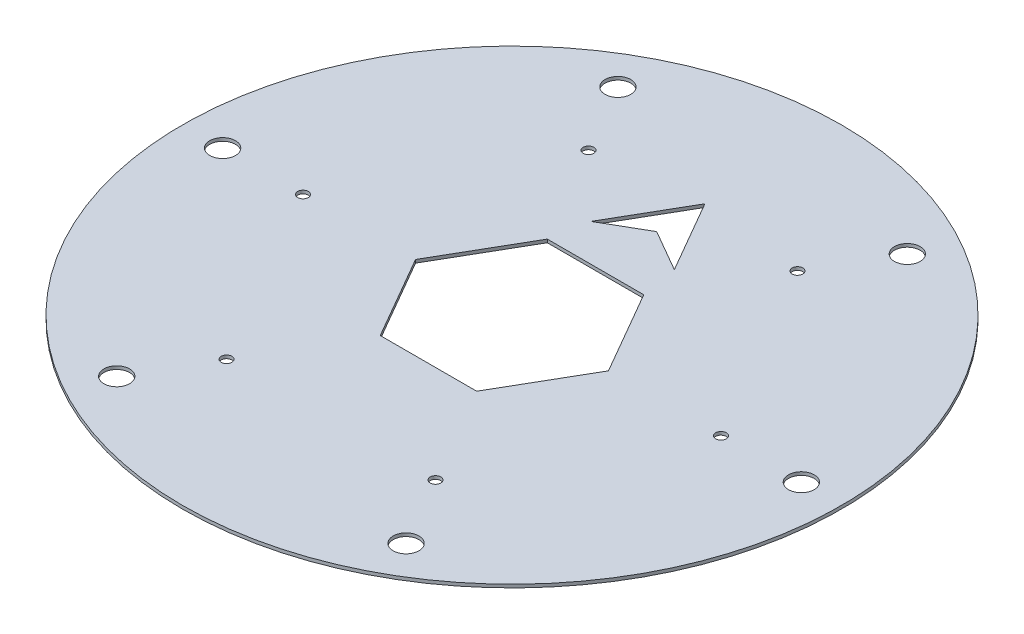
ISO-10303-21;
HEADER;
FILE_DESCRIPTION(('STEP AP214'),'2;1');
FILE_NAME('part.step','',(''),(''),'','','');
FILE_SCHEMA(('AUTOMOTIVE_DESIGN { 1 0 10303 214 1 1 1 1 }'));
ENDSEC;
DATA;
#1=APPLICATION_CONTEXT('core data for automotive mechanical design processes');
#2=APPLICATION_PROTOCOL_DEFINITION('international standard','automotive_design',2000,#1);
#3=PRODUCT_CONTEXT('',#1,'mechanical');
#4=PRODUCT('Part','Part','',(#3));
#5=PRODUCT_RELATED_PRODUCT_CATEGORY('part','',(#4));
#6=PRODUCT_DEFINITION_FORMATION('','',#4);
#7=PRODUCT_DEFINITION_CONTEXT('part definition',#1,'design');
#8=PRODUCT_DEFINITION('design','',#6,#7);
#9=PRODUCT_DEFINITION_SHAPE('','',#8);
#10=(LENGTH_UNIT() NAMED_UNIT(*) SI_UNIT(.MILLI.,.METRE.));
#11=(NAMED_UNIT(*) PLANE_ANGLE_UNIT() SI_UNIT($,.RADIAN.));
#12=(NAMED_UNIT(*) SI_UNIT($,.STERADIAN.) SOLID_ANGLE_UNIT());
#13=UNCERTAINTY_MEASURE_WITH_UNIT(LENGTH_MEASURE(1.E-05),#10,'distance_accuracy_value','');
#14=(GEOMETRIC_REPRESENTATION_CONTEXT(3) GLOBAL_UNCERTAINTY_ASSIGNED_CONTEXT((#13)) GLOBAL_UNIT_ASSIGNED_CONTEXT((#10,
#11,#12)) REPRESENTATION_CONTEXT('',''));
#15=CARTESIAN_POINT('',(0.,0.,0.));
#16=DIRECTION('',(0.,0.,1.));
#17=DIRECTION('',(1.,0.,0.));
#18=AXIS2_PLACEMENT_3D('',#15,#16,#17);
#19=CARTESIAN_POINT('',(0.,-1.,0.));
#20=DIRECTION('',(0.,1.,0.));
#21=DIRECTION('',(0.,0.,1.));
#22=AXIS2_PLACEMENT_3D('',#19,#20,#21);
#23=CYLINDRICAL_SURFACE('',#22,102.5);
#24=CARTESIAN_POINT('',(0.,-1.,0.));
#25=DIRECTION('',(0.,1.,0.));
#26=DIRECTION('',(0.,0.,1.));
#27=AXIS2_PLACEMENT_3D('',#24,#25,#26);
#28=CIRCLE('',#27,102.5);
#29=CARTESIAN_POINT('',(0.,-1.,102.5));
#30=VERTEX_POINT('',#29);
#31=EDGE_CURVE('E11',#30,#30,#28,.T.);
#32=ORIENTED_EDGE('',*,*,#31,.T.);
#33=EDGE_LOOP('',(#32));
#34=FACE_BOUND('',#33,.T.);
#35=CARTESIAN_POINT('',(0.,0.,0.));
#36=DIRECTION('',(0.,1.,0.));
#37=DIRECTION('',(0.,0.,1.));
#38=AXIS2_PLACEMENT_3D('',#35,#36,#37);
#39=CIRCLE('',#38,102.5);
#40=CARTESIAN_POINT('',(0.,0.,102.5));
#41=VERTEX_POINT('',#40);
#42=EDGE_CURVE('E40',#41,#41,#39,.T.);
#43=ORIENTED_EDGE('',*,*,#42,.F.);
#44=EDGE_LOOP('',(#43));
#45=FACE_BOUND('',#44,.T.);
#46=ADVANCED_FACE('F37',(#34,#45),#23,.T.);
#47=CARTESIAN_POINT('',(0.,-1.,0.));
#48=DIRECTION('',(0.,1.,0.));
#49=DIRECTION('',(0.,0.,1.));
#50=AXIS2_PLACEMENT_3D('',#47,#48,#49);
#51=PLANE('',#50);
#52=CARTESIAN_POINT('',(65.,-1.,0.));
#53=DIRECTION('',(0.,1.,0.));
#54=DIRECTION('',(0.,0.,1.));
#55=AXIS2_PLACEMENT_3D('',#52,#53,#54);
#56=CIRCLE('',#55,1.64999999999998);
#57=CARTESIAN_POINT('',(65.,-1.,1.64999999999998));
#58=VERTEX_POINT('',#57);
#59=EDGE_CURVE('E322',#58,#58,#56,.T.);
#60=ORIENTED_EDGE('',*,*,#59,.T.);
#61=EDGE_LOOP('',(#60));
#62=FACE_BOUND('',#61,.T.);
#63=CARTESIAN_POINT('',(32.5,-1.,-56.2916512459885));
#64=DIRECTION('',(0.,1.,0.));
#65=DIRECTION('',(0.,0.,1.));
#66=AXIS2_PLACEMENT_3D('',#63,#64,#65);
#67=CIRCLE('',#66,1.64999999999998);
#68=CARTESIAN_POINT('',(32.5,-1.,-54.6416512459885));
#69=VERTEX_POINT('',#68);
#70=EDGE_CURVE('E331',#69,#69,#67,.T.);
#71=ORIENTED_EDGE('',*,*,#70,.T.);
#72=EDGE_LOOP('',(#71));
#73=FACE_BOUND('',#72,.T.);
#74=CARTESIAN_POINT('',(-32.5,-1.,-56.2916512459885));
#75=DIRECTION('',(0.,1.,0.));
#76=DIRECTION('',(0.,0.,1.));
#77=AXIS2_PLACEMENT_3D('',#74,#75,#76);
#78=CIRCLE('',#77,1.64999999999999);
#79=CARTESIAN_POINT('',(-32.5,-1.,-54.6416512459885));
#80=VERTEX_POINT('',#79);
#81=EDGE_CURVE('E337',#80,#80,#78,.T.);
#82=ORIENTED_EDGE('',*,*,#81,.T.);
#83=EDGE_LOOP('',(#82));
#84=FACE_BOUND('',#83,.T.);
#85=CARTESIAN_POINT('',(-65.,-1.,0.));
#86=DIRECTION('',(0.,1.,0.));
#87=DIRECTION('',(0.,0.,1.));
#88=AXIS2_PLACEMENT_3D('',#85,#86,#87);
#89=CIRCLE('',#88,1.64999999999998);
#90=CARTESIAN_POINT('',(-65.,-1.,1.64999999999998));
#91=VERTEX_POINT('',#90);
#92=EDGE_CURVE('E343',#91,#91,#89,.T.);
#93=ORIENTED_EDGE('',*,*,#92,.T.);
#94=EDGE_LOOP('',(#93));
#95=FACE_BOUND('',#94,.T.);
#96=CARTESIAN_POINT('',(-32.5,-1.,56.2916512459885));
#97=DIRECTION('',(0.,1.,0.));
#98=DIRECTION('',(0.,0.,1.));
#99=AXIS2_PLACEMENT_3D('',#96,#97,#98);
#100=CIRCLE('',#99,1.64999999999999);
#101=CARTESIAN_POINT('',(-32.5,-1.,57.9416512459885));
#102=VERTEX_POINT('',#101);
#103=EDGE_CURVE('E349',#102,#102,#100,.T.);
#104=ORIENTED_EDGE('',*,*,#103,.T.);
#105=EDGE_LOOP('',(#104));
#106=FACE_BOUND('',#105,.T.);
#107=CARTESIAN_POINT('',(32.5,-1.,56.2916512459885));
#108=DIRECTION('',(0.,1.,0.));
#109=DIRECTION('',(0.,0.,1.));
#110=AXIS2_PLACEMENT_3D('',#107,#108,#109);
#111=CIRCLE('',#110,1.64999999999999);
#112=CARTESIAN_POINT('',(32.5,-1.,57.9416512459885));
#113=VERTEX_POINT('',#112);
#114=EDGE_CURVE('E355',#113,#113,#111,.T.);
#115=ORIENTED_EDGE('',*,*,#114,.T.);
#116=EDGE_LOOP('',(#115));
#117=FACE_BOUND('',#116,.T.);
#118=CARTESIAN_POINT('',(-45.0000000000009,-1.,-77.942286340599));
#119=DIRECTION('',(0.,1.,0.));
#120=DIRECTION('',(0.,0.,1.));
#121=AXIS2_PLACEMENT_3D('',#118,#119,#120);
#122=CIRCLE('',#121,4.);
#123=CARTESIAN_POINT('',(-45.0000000000009,-1.,-73.942286340599));
#124=VERTEX_POINT('',#123);
#125=EDGE_CURVE('E361',#124,#124,#122,.T.);
#126=ORIENTED_EDGE('',*,*,#125,.T.);
#127=EDGE_LOOP('',(#126));
#128=FACE_BOUND('',#127,.T.);
#129=CARTESIAN_POINT('',(44.9999999999993,-1.,-77.9422863405999));
#130=DIRECTION('',(0.,1.,0.));
#131=DIRECTION('',(0.,0.,1.));
#132=AXIS2_PLACEMENT_3D('',#129,#130,#131);
#133=CIRCLE('',#132,4.);
#134=CARTESIAN_POINT('',(44.9999999999993,-1.,-73.9422863405999));
#135=VERTEX_POINT('',#134);
#136=EDGE_CURVE('E367',#135,#135,#133,.T.);
#137=ORIENTED_EDGE('',*,*,#136,.T.);
#138=EDGE_LOOP('',(#137));
#139=FACE_BOUND('',#138,.T.);
#140=CARTESIAN_POINT('',(90.,-1.,0.));
#141=DIRECTION('',(0.,1.,0.));
#142=DIRECTION('',(0.,0.,1.));
#143=AXIS2_PLACEMENT_3D('',#140,#141,#142);
#144=CIRCLE('',#143,4.);
#145=CARTESIAN_POINT('',(90.,-1.,4.));
#146=VERTEX_POINT('',#145);
#147=EDGE_CURVE('E373',#146,#146,#144,.T.);
#148=ORIENTED_EDGE('',*,*,#147,.T.);
#149=EDGE_LOOP('',(#148));
#150=FACE_BOUND('',#149,.T.);
#151=CARTESIAN_POINT('',(45.0000000000004,-1.,77.9422863405993));
#152=DIRECTION('',(0.,1.,0.));
#153=DIRECTION('',(0.,0.,1.));
#154=AXIS2_PLACEMENT_3D('',#151,#152,#153);
#155=CIRCLE('',#154,4.);
#156=CARTESIAN_POINT('',(45.0000000000004,-1.,81.9422863405993));
#157=VERTEX_POINT('',#156);
#158=EDGE_CURVE('E379',#157,#157,#155,.T.);
#159=ORIENTED_EDGE('',*,*,#158,.T.);
#160=EDGE_LOOP('',(#159));
#161=FACE_BOUND('',#160,.T.);
#162=CARTESIAN_POINT('',(-44.9999999999998,-1.,77.9422863405996));
#163=DIRECTION('',(0.,1.,0.));
#164=DIRECTION('',(0.,0.,1.));
#165=AXIS2_PLACEMENT_3D('',#162,#163,#164);
#166=CIRCLE('',#165,4.);
#167=CARTESIAN_POINT('',(-44.9999999999998,-1.,81.9422863405996));
#168=VERTEX_POINT('',#167);
#169=EDGE_CURVE('E385',#168,#168,#166,.T.);
#170=ORIENTED_EDGE('',*,*,#169,.T.);
#171=EDGE_LOOP('',(#170));
#172=FACE_BOUND('',#171,.T.);
#173=CARTESIAN_POINT('',(-90.,-1.,0.));
#174=DIRECTION('',(0.,1.,0.));
#175=DIRECTION('',(0.,0.,1.));
#176=AXIS2_PLACEMENT_3D('',#173,#174,#175);
#177=CIRCLE('',#176,4.);
#178=CARTESIAN_POINT('',(-90.,-1.,4.));
#179=VERTEX_POINT('',#178);
#180=EDGE_CURVE('E138',#179,#179,#177,.T.);
#181=ORIENTED_EDGE('',*,*,#180,.T.);
#182=EDGE_LOOP('',(#181));
#183=FACE_BOUND('',#182,.T.);
#184=DIRECTION('',(1.,0.,0.));
#185=VECTOR('',#184,1.);
#186=CARTESIAN_POINT('',(-15.,-1.,25.9807621135332));
#187=LINE('',#186,#185);
#188=CARTESIAN_POINT('',(-15.,-1.,25.9807621135332));
#189=VERTEX_POINT('',#188);
#190=CARTESIAN_POINT('',(15.,-1.,25.9807621135332));
#191=VERTEX_POINT('',#190);
#192=EDGE_CURVE('E121',#189,#191,#187,.T.);
#193=ORIENTED_EDGE('',*,*,#192,.T.);
#194=DIRECTION('',(0.5,0.,-0.866025403784439));
#195=VECTOR('',#194,1.);
#196=CARTESIAN_POINT('',(15.,-1.,25.9807621135332));
#197=LINE('',#196,#195);
#198=CARTESIAN_POINT('',(30.,-1.,0.));
#199=VERTEX_POINT('',#198);
#200=EDGE_CURVE('E115',#191,#199,#197,.T.);
#201=ORIENTED_EDGE('',*,*,#200,.T.);
#202=DIRECTION('',(-0.5,0.,-0.866025403784439));
#203=VECTOR('',#202,1.);
#204=CARTESIAN_POINT('',(30.,-1.,0.));
#205=LINE('',#204,#203);
#206=CARTESIAN_POINT('',(15.,-1.,-25.9807621135332));
#207=VERTEX_POINT('',#206);
#208=EDGE_CURVE('E124',#199,#207,#205,.T.);
#209=ORIENTED_EDGE('',*,*,#208,.T.);
#210=DIRECTION('',(-1.,0.,0.));
#211=VECTOR('',#210,1.);
#212=CARTESIAN_POINT('',(15.,-1.,-25.9807621135332));
#213=LINE('',#212,#211);
#214=CARTESIAN_POINT('',(-15.,-1.,-25.9807621135332));
#215=VERTEX_POINT('',#214);
#216=EDGE_CURVE('E51',#207,#215,#213,.T.);
#217=ORIENTED_EDGE('',*,*,#216,.T.);
#218=DIRECTION('',(-0.5,0.,0.866025403784439));
#219=VECTOR('',#218,1.);
#220=CARTESIAN_POINT('',(-15.,-1.,-25.9807621135332));
#221=LINE('',#220,#219);
#222=CARTESIAN_POINT('',(-30.,-1.,0.));
#223=VERTEX_POINT('',#222);
#224=EDGE_CURVE('E142',#215,#223,#221,.T.);
#225=ORIENTED_EDGE('',*,*,#224,.T.);
#226=DIRECTION('',(0.5,0.,0.866025403784439));
#227=VECTOR('',#226,1.);
#228=CARTESIAN_POINT('',(-30.,-1.,0.));
#229=LINE('',#228,#227);
#230=EDGE_CURVE('E145',#223,#189,#229,.T.);
#231=ORIENTED_EDGE('',*,*,#230,.T.);
#232=EDGE_LOOP('',(#193,#201,#209,#217,#225,#231));
#233=FACE_BOUND('',#232,.T.);
#234=DIRECTION('',(-0.500000000000001,0.,0.866025403784438));
#235=VECTOR('',#234,1.);
#236=CARTESIAN_POINT('',(-12.9903810567666,-1.,-37.5000000000001));
#237=LINE('',#236,#235);
#238=CARTESIAN_POINT('',(0.,-1.,-60.));
#239=VERTEX_POINT('',#238);
#240=CARTESIAN_POINT('',(-12.9903810567666,-1.,-37.5000000000001));
#241=VERTEX_POINT('',#240);
#242=EDGE_CURVE('E179',#239,#241,#237,.T.);
#243=ORIENTED_EDGE('',*,*,#242,.T.);
#244=DIRECTION('',(0.866025403784438,0.,-0.500000000000001));
#245=VECTOR('',#244,1.);
#246=CARTESIAN_POINT('',(0.,-1.,-45.0000000000001));
#247=LINE('',#246,#245);
#248=CARTESIAN_POINT('',(0.,-1.,-45.0000000000001));
#249=VERTEX_POINT('',#248);
#250=EDGE_CURVE('E169',#241,#249,#247,.T.);
#251=ORIENTED_EDGE('',*,*,#250,.T.);
#252=DIRECTION('',(0.866025403784437,0.,0.500000000000002));
#253=VECTOR('',#252,1.);
#254=CARTESIAN_POINT('',(12.9903810567666,-1.,-37.5000000000001));
#255=LINE('',#254,#253);
#256=CARTESIAN_POINT('',(12.9903810567666,-1.,-37.5000000000001));
#257=VERTEX_POINT('',#256);
#258=EDGE_CURVE('E172',#249,#257,#255,.T.);
#259=ORIENTED_EDGE('',*,*,#258,.T.);
#260=DIRECTION('',(-0.500000000000001,0.,-0.866025403784438));
#261=VECTOR('',#260,1.);
#262=CARTESIAN_POINT('',(0.,-1.,-60.));
#263=LINE('',#262,#261);
#264=EDGE_CURVE('E176',#257,#239,#263,.T.);
#265=ORIENTED_EDGE('',*,*,#264,.T.);
#266=EDGE_LOOP('',(#243,#251,#259,#265));
#267=FACE_BOUND('',#266,.T.);
#268=ORIENTED_EDGE('',*,*,#31,.F.);
#269=EDGE_LOOP('',(#268));
#270=FACE_BOUND('',#269,.T.);
#271=ADVANCED_FACE('F128',(#62,#73,#84,#95,#106,#117,#128,#139,#150,#161,#172,#183,#233,#267,
#270),#51,.F.);
#272=CARTESIAN_POINT('',(0.,0.,0.));
#273=DIRECTION('',(0.,1.,0.));
#274=DIRECTION('',(0.,0.,1.));
#275=AXIS2_PLACEMENT_3D('',#272,#273,#274);
#276=PLANE('',#275);
#277=CARTESIAN_POINT('',(65.,0.,0.));
#278=DIRECTION('',(0.,1.,0.));
#279=DIRECTION('',(0.,0.,1.));
#280=AXIS2_PLACEMENT_3D('',#277,#278,#279);
#281=CIRCLE('',#280,1.64999999999998);
#282=CARTESIAN_POINT('',(65.,0.,1.64999999999998));
#283=VERTEX_POINT('',#282);
#284=EDGE_CURVE('E324',#283,#283,#281,.T.);
#285=ORIENTED_EDGE('',*,*,#284,.F.);
#286=EDGE_LOOP('',(#285));
#287=FACE_BOUND('',#286,.T.);
#288=CARTESIAN_POINT('',(32.5,0.,-56.2916512459885));
#289=DIRECTION('',(0.,1.,0.));
#290=DIRECTION('',(0.,0.,1.));
#291=AXIS2_PLACEMENT_3D('',#288,#289,#290);
#292=CIRCLE('',#291,1.64999999999998);
#293=CARTESIAN_POINT('',(32.5,0.,-54.6416512459885));
#294=VERTEX_POINT('',#293);
#295=EDGE_CURVE('E326',#294,#294,#292,.T.);
#296=ORIENTED_EDGE('',*,*,#295,.F.);
#297=EDGE_LOOP('',(#296));
#298=FACE_BOUND('',#297,.T.);
#299=CARTESIAN_POINT('',(-32.5,0.,-56.2916512459885));
#300=DIRECTION('',(0.,1.,0.));
#301=DIRECTION('',(0.,0.,1.));
#302=AXIS2_PLACEMENT_3D('',#299,#300,#301);
#303=CIRCLE('',#302,1.64999999999999);
#304=CARTESIAN_POINT('',(-32.5,0.,-54.6416512459885));
#305=VERTEX_POINT('',#304);
#306=EDGE_CURVE('E334',#305,#305,#303,.T.);
#307=ORIENTED_EDGE('',*,*,#306,.F.);
#308=EDGE_LOOP('',(#307));
#309=FACE_BOUND('',#308,.T.);
#310=CARTESIAN_POINT('',(-65.,0.,0.));
#311=DIRECTION('',(0.,1.,0.));
#312=DIRECTION('',(0.,0.,1.));
#313=AXIS2_PLACEMENT_3D('',#310,#311,#312);
#314=CIRCLE('',#313,1.64999999999998);
#315=CARTESIAN_POINT('',(-65.,0.,1.64999999999998));
#316=VERTEX_POINT('',#315);
#317=EDGE_CURVE('E340',#316,#316,#314,.T.);
#318=ORIENTED_EDGE('',*,*,#317,.F.);
#319=EDGE_LOOP('',(#318));
#320=FACE_BOUND('',#319,.T.);
#321=CARTESIAN_POINT('',(-32.5,0.,56.2916512459885));
#322=DIRECTION('',(0.,1.,0.));
#323=DIRECTION('',(0.,0.,1.));
#324=AXIS2_PLACEMENT_3D('',#321,#322,#323);
#325=CIRCLE('',#324,1.64999999999999);
#326=CARTESIAN_POINT('',(-32.5,0.,57.9416512459885));
#327=VERTEX_POINT('',#326);
#328=EDGE_CURVE('E346',#327,#327,#325,.T.);
#329=ORIENTED_EDGE('',*,*,#328,.F.);
#330=EDGE_LOOP('',(#329));
#331=FACE_BOUND('',#330,.T.);
#332=CARTESIAN_POINT('',(32.5,0.,56.2916512459885));
#333=DIRECTION('',(0.,1.,0.));
#334=DIRECTION('',(0.,0.,1.));
#335=AXIS2_PLACEMENT_3D('',#332,#333,#334);
#336=CIRCLE('',#335,1.64999999999999);
#337=CARTESIAN_POINT('',(32.5,0.,57.9416512459885));
#338=VERTEX_POINT('',#337);
#339=EDGE_CURVE('E352',#338,#338,#336,.T.);
#340=ORIENTED_EDGE('',*,*,#339,.F.);
#341=EDGE_LOOP('',(#340));
#342=FACE_BOUND('',#341,.T.);
#343=CARTESIAN_POINT('',(-45.0000000000009,0.,-77.942286340599));
#344=DIRECTION('',(0.,1.,0.));
#345=DIRECTION('',(0.,0.,1.));
#346=AXIS2_PLACEMENT_3D('',#343,#344,#345);
#347=CIRCLE('',#346,4.);
#348=CARTESIAN_POINT('',(-45.0000000000009,0.,-73.942286340599));
#349=VERTEX_POINT('',#348);
#350=EDGE_CURVE('E358',#349,#349,#347,.T.);
#351=ORIENTED_EDGE('',*,*,#350,.F.);
#352=EDGE_LOOP('',(#351));
#353=FACE_BOUND('',#352,.T.);
#354=CARTESIAN_POINT('',(44.9999999999993,0.,-77.9422863405999));
#355=DIRECTION('',(0.,1.,0.));
#356=DIRECTION('',(0.,0.,1.));
#357=AXIS2_PLACEMENT_3D('',#354,#355,#356);
#358=CIRCLE('',#357,4.);
#359=CARTESIAN_POINT('',(44.9999999999993,0.,-73.9422863405999));
#360=VERTEX_POINT('',#359);
#361=EDGE_CURVE('E364',#360,#360,#358,.T.);
#362=ORIENTED_EDGE('',*,*,#361,.F.);
#363=EDGE_LOOP('',(#362));
#364=FACE_BOUND('',#363,.T.);
#365=CARTESIAN_POINT('',(90.,0.,0.));
#366=DIRECTION('',(0.,1.,0.));
#367=DIRECTION('',(0.,0.,1.));
#368=AXIS2_PLACEMENT_3D('',#365,#366,#367);
#369=CIRCLE('',#368,4.);
#370=CARTESIAN_POINT('',(90.,0.,4.));
#371=VERTEX_POINT('',#370);
#372=EDGE_CURVE('E370',#371,#371,#369,.T.);
#373=ORIENTED_EDGE('',*,*,#372,.F.);
#374=EDGE_LOOP('',(#373));
#375=FACE_BOUND('',#374,.T.);
#376=CARTESIAN_POINT('',(45.0000000000004,0.,77.9422863405993));
#377=DIRECTION('',(0.,1.,0.));
#378=DIRECTION('',(0.,0.,1.));
#379=AXIS2_PLACEMENT_3D('',#376,#377,#378);
#380=CIRCLE('',#379,4.);
#381=CARTESIAN_POINT('',(45.0000000000004,0.,81.9422863405993));
#382=VERTEX_POINT('',#381);
#383=EDGE_CURVE('E376',#382,#382,#380,.T.);
#384=ORIENTED_EDGE('',*,*,#383,.F.);
#385=EDGE_LOOP('',(#384));
#386=FACE_BOUND('',#385,.T.);
#387=CARTESIAN_POINT('',(-44.9999999999998,0.,77.9422863405996));
#388=DIRECTION('',(0.,1.,0.));
#389=DIRECTION('',(0.,0.,1.));
#390=AXIS2_PLACEMENT_3D('',#387,#388,#389);
#391=CIRCLE('',#390,4.);
#392=CARTESIAN_POINT('',(-44.9999999999998,0.,81.9422863405996));
#393=VERTEX_POINT('',#392);
#394=EDGE_CURVE('E382',#393,#393,#391,.T.);
#395=ORIENTED_EDGE('',*,*,#394,.F.);
#396=EDGE_LOOP('',(#395));
#397=FACE_BOUND('',#396,.T.);
#398=CARTESIAN_POINT('',(-90.,0.,0.));
#399=DIRECTION('',(0.,1.,0.));
#400=DIRECTION('',(0.,0.,1.));
#401=AXIS2_PLACEMENT_3D('',#398,#399,#400);
#402=CIRCLE('',#401,4.);
#403=CARTESIAN_POINT('',(-90.,0.,4.));
#404=VERTEX_POINT('',#403);
#405=EDGE_CURVE('E387',#404,#404,#402,.T.);
#406=ORIENTED_EDGE('',*,*,#405,.F.);
#407=EDGE_LOOP('',(#406));
#408=FACE_BOUND('',#407,.T.);
#409=DIRECTION('',(0.5,0.,-0.866025403784439));
#410=VECTOR('',#409,1.);
#411=CARTESIAN_POINT('',(15.,0.,25.9807621135332));
#412=LINE('',#411,#410);
#413=CARTESIAN_POINT('',(15.,0.,25.9807621135332));
#414=VERTEX_POINT('',#413);
#415=CARTESIAN_POINT('',(30.,0.,0.));
#416=VERTEX_POINT('',#415);
#417=EDGE_CURVE('E59',#414,#416,#412,.T.);
#418=ORIENTED_EDGE('',*,*,#417,.F.);
#419=DIRECTION('',(1.,0.,0.));
#420=VECTOR('',#419,1.);
#421=CARTESIAN_POINT('',(-15.,0.,25.9807621135332));
#422=LINE('',#421,#420);
#423=CARTESIAN_POINT('',(-15.,0.,25.9807621135332));
#424=VERTEX_POINT('',#423);
#425=EDGE_CURVE('E132',#424,#414,#422,.T.);
#426=ORIENTED_EDGE('',*,*,#425,.F.);
#427=DIRECTION('',(0.5,0.,0.866025403784439));
#428=VECTOR('',#427,1.);
#429=CARTESIAN_POINT('',(-30.,0.,0.));
#430=LINE('',#429,#428);
#431=CARTESIAN_POINT('',(-30.,0.,0.));
#432=VERTEX_POINT('',#431);
#433=EDGE_CURVE('E135',#432,#424,#430,.T.);
#434=ORIENTED_EDGE('',*,*,#433,.F.);
#435=DIRECTION('',(-0.5,0.,0.866025403784439));
#436=VECTOR('',#435,1.);
#437=CARTESIAN_POINT('',(-15.,0.,-25.9807621135332));
#438=LINE('',#437,#436);
#439=CARTESIAN_POINT('',(-15.,0.,-25.9807621135332));
#440=VERTEX_POINT('',#439);
#441=EDGE_CURVE('E154',#440,#432,#438,.T.);
#442=ORIENTED_EDGE('',*,*,#441,.F.);
#443=DIRECTION('',(-1.,0.,0.));
#444=VECTOR('',#443,1.);
#445=CARTESIAN_POINT('',(15.,0.,-25.9807621135332));
#446=LINE('',#445,#444);
#447=CARTESIAN_POINT('',(15.,0.,-25.9807621135332));
#448=VERTEX_POINT('',#447);
#449=EDGE_CURVE('E151',#448,#440,#446,.T.);
#450=ORIENTED_EDGE('',*,*,#449,.F.);
#451=DIRECTION('',(-0.5,0.,-0.866025403784439));
#452=VECTOR('',#451,1.);
#453=CARTESIAN_POINT('',(30.,0.,0.));
#454=LINE('',#453,#452);
#455=EDGE_CURVE('E149',#416,#448,#454,.T.);
#456=ORIENTED_EDGE('',*,*,#455,.F.);
#457=EDGE_LOOP('',(#418,#426,#434,#442,#450,#456));
#458=FACE_BOUND('',#457,.T.);
#459=DIRECTION('',(0.866025403784438,0.,-0.500000000000001));
#460=VECTOR('',#459,1.);
#461=CARTESIAN_POINT('',(0.,0.,-45.0000000000001));
#462=LINE('',#461,#460);
#463=CARTESIAN_POINT('',(-12.9903810567666,0.,-37.5000000000001));
#464=VERTEX_POINT('',#463);
#465=CARTESIAN_POINT('',(0.,0.,-45.0000000000001));
#466=VERTEX_POINT('',#465);
#467=EDGE_CURVE('E161',#464,#466,#462,.T.);
#468=ORIENTED_EDGE('',*,*,#467,.F.);
#469=DIRECTION('',(-0.500000000000001,0.,0.866025403784438));
#470=VECTOR('',#469,1.);
#471=CARTESIAN_POINT('',(-12.9903810567666,0.,-37.5000000000001));
#472=LINE('',#471,#470);
#473=CARTESIAN_POINT('',(0.,0.,-60.));
#474=VERTEX_POINT('',#473);
#475=EDGE_CURVE('E173',#474,#464,#472,.T.);
#476=ORIENTED_EDGE('',*,*,#475,.F.);
#477=DIRECTION('',(-0.500000000000001,0.,-0.866025403784438));
#478=VECTOR('',#477,1.);
#479=CARTESIAN_POINT('',(0.,0.,-60.));
#480=LINE('',#479,#478);
#481=CARTESIAN_POINT('',(12.9903810567666,0.,-37.5000000000001));
#482=VERTEX_POINT('',#481);
#483=EDGE_CURVE('E187',#482,#474,#480,.T.);
#484=ORIENTED_EDGE('',*,*,#483,.F.);
#485=DIRECTION('',(0.866025403784437,0.,0.500000000000002));
#486=VECTOR('',#485,1.);
#487=CARTESIAN_POINT('',(12.9903810567666,0.,-37.5000000000001));
#488=LINE('',#487,#486);
#489=EDGE_CURVE('E184',#466,#482,#488,.T.);
#490=ORIENTED_EDGE('',*,*,#489,.F.);
#491=EDGE_LOOP('',(#468,#476,#484,#490));
#492=FACE_BOUND('',#491,.T.);
#493=ORIENTED_EDGE('',*,*,#42,.T.);
#494=EDGE_LOOP('',(#493));
#495=FACE_BOUND('',#494,.T.);
#496=ADVANCED_FACE('F209',(#287,#298,#309,#320,#331,#342,#353,#364,#375,#386,#397,#408,#458,
#492,#495),#276,.T.);
#497=CARTESIAN_POINT('',(0.,-1.,-45.0000000000001));
#498=DIRECTION('',(0.500000000000001,0.,0.866025403784438));
#499=DIRECTION('',(0.866025403784438,0.,-0.500000000000001));
#500=AXIS2_PLACEMENT_3D('',#497,#498,#499);
#501=PLANE('',#500);
#502=ORIENTED_EDGE('',*,*,#467,.T.);
#503=DIRECTION('',(0.,1.,0.));
#504=VECTOR('',#503,1.);
#505=CARTESIAN_POINT('',(0.,-1.,-45.0000000000001));
#506=LINE('',#505,#504);
#507=EDGE_CURVE('E182',#249,#466,#506,.T.);
#508=ORIENTED_EDGE('',*,*,#507,.F.);
#509=ORIENTED_EDGE('',*,*,#250,.F.);
#510=DIRECTION('',(0.,1.,0.));
#511=VECTOR('',#510,1.);
#512=CARTESIAN_POINT('',(-12.9903810567666,-1.,-37.5000000000001));
#513=LINE('',#512,#511);
#514=EDGE_CURVE('E192',#241,#464,#513,.T.);
#515=ORIENTED_EDGE('',*,*,#514,.T.);
#516=EDGE_LOOP('',(#502,#508,#509,#515));
#517=FACE_BOUND('',#516,.T.);
#518=ADVANCED_FACE('F216',(#517),#501,.F.);
#519=CARTESIAN_POINT('',(-12.9903810567666,-1.,-37.5000000000001));
#520=DIRECTION('',(-0.866025403784438,0.,-0.500000000000001));
#521=DIRECTION('',(-0.500000000000001,0.,0.866025403784438));
#522=AXIS2_PLACEMENT_3D('',#519,#520,#521);
#523=PLANE('',#522);
#524=ORIENTED_EDGE('',*,*,#475,.T.);
#525=ORIENTED_EDGE('',*,*,#514,.F.);
#526=ORIENTED_EDGE('',*,*,#242,.F.);
#527=DIRECTION('',(0.,1.,0.));
#528=VECTOR('',#527,1.);
#529=CARTESIAN_POINT('',(0.,-1.,-60.));
#530=LINE('',#529,#528);
#531=EDGE_CURVE('E194',#239,#474,#530,.T.);
#532=ORIENTED_EDGE('',*,*,#531,.T.);
#533=EDGE_LOOP('',(#524,#525,#526,#532));
#534=FACE_BOUND('',#533,.T.);
#535=ADVANCED_FACE('F218',(#534),#523,.F.);
#536=CARTESIAN_POINT('',(0.,-1.,-60.));
#537=DIRECTION('',(0.866025403784438,0.,-0.500000000000001));
#538=DIRECTION('',(-0.500000000000001,0.,-0.866025403784438));
#539=AXIS2_PLACEMENT_3D('',#536,#537,#538);
#540=PLANE('',#539);
#541=ORIENTED_EDGE('',*,*,#483,.T.);
#542=ORIENTED_EDGE('',*,*,#531,.F.);
#543=ORIENTED_EDGE('',*,*,#264,.F.);
#544=DIRECTION('',(0.,1.,0.));
#545=VECTOR('',#544,1.);
#546=CARTESIAN_POINT('',(12.9903810567666,-1.,-37.5000000000001));
#547=LINE('',#546,#545);
#548=EDGE_CURVE('E196',#257,#482,#547,.T.);
#549=ORIENTED_EDGE('',*,*,#548,.T.);
#550=EDGE_LOOP('',(#541,#542,#543,#549));
#551=FACE_BOUND('',#550,.T.);
#552=ADVANCED_FACE('F213',(#551),#540,.F.);
#553=CARTESIAN_POINT('',(12.9903810567666,-1.,-37.5000000000001));
#554=DIRECTION('',(-0.500000000000002,0.,0.866025403784438));
#555=DIRECTION('',(0.866025403784437,0.,0.500000000000002));
#556=AXIS2_PLACEMENT_3D('',#553,#554,#555);
#557=PLANE('',#556);
#558=ORIENTED_EDGE('',*,*,#489,.T.);
#559=ORIENTED_EDGE('',*,*,#548,.F.);
#560=ORIENTED_EDGE('',*,*,#258,.F.);
#561=ORIENTED_EDGE('',*,*,#507,.T.);
#562=EDGE_LOOP('',(#558,#559,#560,#561));
#563=FACE_BOUND('',#562,.T.);
#564=ADVANCED_FACE('F202',(#563),#557,.F.);
#565=CARTESIAN_POINT('',(15.,-1.,25.9807621135332));
#566=DIRECTION('',(0.866025403784439,0.,0.5));
#567=DIRECTION('',(0.5,0.,-0.866025403784439));
#568=AXIS2_PLACEMENT_3D('',#565,#566,#567);
#569=PLANE('',#568);
#570=ORIENTED_EDGE('',*,*,#417,.T.);
#571=DIRECTION('',(0.,1.,0.));
#572=VECTOR('',#571,1.);
#573=CARTESIAN_POINT('',(30.,-1.,0.));
#574=LINE('',#573,#572);
#575=EDGE_CURVE('E111',#199,#416,#574,.T.);
#576=ORIENTED_EDGE('',*,*,#575,.F.);
#577=ORIENTED_EDGE('',*,*,#200,.F.);
#578=DIRECTION('',(0.,1.,0.));
#579=VECTOR('',#578,1.);
#580=CARTESIAN_POINT('',(15.,-1.,25.9807621135332));
#581=LINE('',#580,#579);
#582=EDGE_CURVE('E159',#191,#414,#581,.T.);
#583=ORIENTED_EDGE('',*,*,#582,.T.);
#584=EDGE_LOOP('',(#570,#576,#577,#583));
#585=FACE_BOUND('',#584,.T.);
#586=ADVANCED_FACE('F113',(#585),#569,.F.);
#587=CARTESIAN_POINT('',(-15.,-1.,25.9807621135332));
#588=DIRECTION('',(0.,0.,1.));
#589=DIRECTION('',(1.,0.,0.));
#590=AXIS2_PLACEMENT_3D('',#587,#588,#589);
#591=PLANE('',#590);
#592=ORIENTED_EDGE('',*,*,#425,.T.);
#593=ORIENTED_EDGE('',*,*,#582,.F.);
#594=ORIENTED_EDGE('',*,*,#192,.F.);
#595=DIRECTION('',(0.,1.,0.));
#596=VECTOR('',#595,1.);
#597=CARTESIAN_POINT('',(-15.,-1.,25.9807621135332));
#598=LINE('',#597,#596);
#599=EDGE_CURVE('E162',#189,#424,#598,.T.);
#600=ORIENTED_EDGE('',*,*,#599,.T.);
#601=EDGE_LOOP('',(#592,#593,#594,#600));
#602=FACE_BOUND('',#601,.T.);
#603=ADVANCED_FACE('F250',(#602),#591,.F.);
#604=CARTESIAN_POINT('',(-30.,-1.,0.));
#605=DIRECTION('',(-0.866025403784439,0.,0.5));
#606=DIRECTION('',(0.5,0.,0.866025403784439));
#607=AXIS2_PLACEMENT_3D('',#604,#605,#606);
#608=PLANE('',#607);
#609=ORIENTED_EDGE('',*,*,#433,.T.);
#610=ORIENTED_EDGE('',*,*,#599,.F.);
#611=ORIENTED_EDGE('',*,*,#230,.F.);
#612=DIRECTION('',(0.,1.,0.));
#613=VECTOR('',#612,1.);
#614=CARTESIAN_POINT('',(-30.,-1.,0.));
#615=LINE('',#614,#613);
#616=EDGE_CURVE('E164',#223,#432,#615,.T.);
#617=ORIENTED_EDGE('',*,*,#616,.T.);
#618=EDGE_LOOP('',(#609,#610,#611,#617));
#619=FACE_BOUND('',#618,.T.);
#620=ADVANCED_FACE('F254',(#619),#608,.F.);
#621=CARTESIAN_POINT('',(-15.,-1.,-25.9807621135332));
#622=DIRECTION('',(-0.866025403784439,0.,-0.5));
#623=DIRECTION('',(-0.5,0.,0.866025403784439));
#624=AXIS2_PLACEMENT_3D('',#621,#622,#623);
#625=PLANE('',#624);
#626=ORIENTED_EDGE('',*,*,#441,.T.);
#627=ORIENTED_EDGE('',*,*,#616,.F.);
#628=ORIENTED_EDGE('',*,*,#224,.F.);
#629=DIRECTION('',(0.,1.,0.));
#630=VECTOR('',#629,1.);
#631=CARTESIAN_POINT('',(-15.,-1.,-25.9807621135332));
#632=LINE('',#631,#630);
#633=EDGE_CURVE('E166',#215,#440,#632,.T.);
#634=ORIENTED_EDGE('',*,*,#633,.T.);
#635=EDGE_LOOP('',(#626,#627,#628,#634));
#636=FACE_BOUND('',#635,.T.);
#637=ADVANCED_FACE('F264',(#636),#625,.F.);
#638=CARTESIAN_POINT('',(15.,-1.,-25.9807621135332));
#639=DIRECTION('',(0.,0.,-1.));
#640=DIRECTION('',(-1.,0.,0.));
#641=AXIS2_PLACEMENT_3D('',#638,#639,#640);
#642=PLANE('',#641);
#643=ORIENTED_EDGE('',*,*,#449,.T.);
#644=ORIENTED_EDGE('',*,*,#633,.F.);
#645=ORIENTED_EDGE('',*,*,#216,.F.);
#646=DIRECTION('',(0.,1.,0.));
#647=VECTOR('',#646,1.);
#648=CARTESIAN_POINT('',(15.,-1.,-25.9807621135332));
#649=LINE('',#648,#647);
#650=EDGE_CURVE('E120',#207,#448,#649,.T.);
#651=ORIENTED_EDGE('',*,*,#650,.T.);
#652=EDGE_LOOP('',(#643,#644,#645,#651));
#653=FACE_BOUND('',#652,.T.);
#654=ADVANCED_FACE('F261',(#653),#642,.F.);
#655=CARTESIAN_POINT('',(30.,-1.,0.));
#656=DIRECTION('',(0.866025403784439,0.,-0.5));
#657=DIRECTION('',(-0.5,0.,-0.866025403784439));
#658=AXIS2_PLACEMENT_3D('',#655,#656,#657);
#659=PLANE('',#658);
#660=ORIENTED_EDGE('',*,*,#455,.T.);
#661=ORIENTED_EDGE('',*,*,#650,.F.);
#662=ORIENTED_EDGE('',*,*,#208,.F.);
#663=ORIENTED_EDGE('',*,*,#575,.T.);
#664=EDGE_LOOP('',(#660,#661,#662,#663));
#665=FACE_BOUND('',#664,.T.);
#666=ADVANCED_FACE('F125',(#665),#659,.F.);
#667=CARTESIAN_POINT('',(-90.,0.,0.));
#668=DIRECTION('',(0.,1.,0.));
#669=DIRECTION('',(0.,0.,1.));
#670=AXIS2_PLACEMENT_3D('',#667,#668,#669);
#671=CYLINDRICAL_SURFACE('',#670,4.);
#672=ORIENTED_EDGE('',*,*,#180,.F.);
#673=EDGE_LOOP('',(#672));
#674=FACE_BOUND('',#673,.T.);
#675=ORIENTED_EDGE('',*,*,#405,.T.);
#676=EDGE_LOOP('',(#675));
#677=FACE_BOUND('',#676,.T.);
#678=ADVANCED_FACE('F260',(#674,#677),#671,.F.);
#679=CARTESIAN_POINT('',(-44.9999999999998,0.,77.9422863405996));
#680=DIRECTION('',(0.,1.,0.));
#681=DIRECTION('',(0.,0.,1.));
#682=AXIS2_PLACEMENT_3D('',#679,#680,#681);
#683=CYLINDRICAL_SURFACE('',#682,4.);
#684=ORIENTED_EDGE('',*,*,#169,.F.);
#685=EDGE_LOOP('',(#684));
#686=FACE_BOUND('',#685,.T.);
#687=ORIENTED_EDGE('',*,*,#394,.T.);
#688=EDGE_LOOP('',(#687));
#689=FACE_BOUND('',#688,.T.);
#690=ADVANCED_FACE('F273',(#686,#689),#683,.F.);
#691=CARTESIAN_POINT('',(45.0000000000004,0.,77.9422863405993));
#692=DIRECTION('',(0.,1.,0.));
#693=DIRECTION('',(0.,0.,1.));
#694=AXIS2_PLACEMENT_3D('',#691,#692,#693);
#695=CYLINDRICAL_SURFACE('',#694,4.);
#696=ORIENTED_EDGE('',*,*,#158,.F.);
#697=EDGE_LOOP('',(#696));
#698=FACE_BOUND('',#697,.T.);
#699=ORIENTED_EDGE('',*,*,#383,.T.);
#700=EDGE_LOOP('',(#699));
#701=FACE_BOUND('',#700,.T.);
#702=ADVANCED_FACE('F277',(#698,#701),#695,.F.);
#703=CARTESIAN_POINT('',(90.,0.,0.));
#704=DIRECTION('',(0.,1.,0.));
#705=DIRECTION('',(0.,0.,1.));
#706=AXIS2_PLACEMENT_3D('',#703,#704,#705);
#707=CYLINDRICAL_SURFACE('',#706,4.);
#708=ORIENTED_EDGE('',*,*,#147,.F.);
#709=EDGE_LOOP('',(#708));
#710=FACE_BOUND('',#709,.T.);
#711=ORIENTED_EDGE('',*,*,#372,.T.);
#712=EDGE_LOOP('',(#711));
#713=FACE_BOUND('',#712,.T.);
#714=ADVANCED_FACE('F281',(#710,#713),#707,.F.);
#715=CARTESIAN_POINT('',(44.9999999999993,0.,-77.9422863405999));
#716=DIRECTION('',(0.,1.,0.));
#717=DIRECTION('',(0.,0.,1.));
#718=AXIS2_PLACEMENT_3D('',#715,#716,#717);
#719=CYLINDRICAL_SURFACE('',#718,4.);
#720=ORIENTED_EDGE('',*,*,#136,.F.);
#721=EDGE_LOOP('',(#720));
#722=FACE_BOUND('',#721,.T.);
#723=ORIENTED_EDGE('',*,*,#361,.T.);
#724=EDGE_LOOP('',(#723));
#725=FACE_BOUND('',#724,.T.);
#726=ADVANCED_FACE('F285',(#722,#725),#719,.F.);
#727=CARTESIAN_POINT('',(-45.0000000000009,0.,-77.942286340599));
#728=DIRECTION('',(0.,1.,0.));
#729=DIRECTION('',(0.,0.,1.));
#730=AXIS2_PLACEMENT_3D('',#727,#728,#729);
#731=CYLINDRICAL_SURFACE('',#730,4.);
#732=ORIENTED_EDGE('',*,*,#125,.F.);
#733=EDGE_LOOP('',(#732));
#734=FACE_BOUND('',#733,.T.);
#735=ORIENTED_EDGE('',*,*,#350,.T.);
#736=EDGE_LOOP('',(#735));
#737=FACE_BOUND('',#736,.T.);
#738=ADVANCED_FACE('F289',(#734,#737),#731,.F.);
#739=CARTESIAN_POINT('',(32.5,0.,56.2916512459885));
#740=DIRECTION('',(0.,1.,0.));
#741=DIRECTION('',(0.,0.,1.));
#742=AXIS2_PLACEMENT_3D('',#739,#740,#741);
#743=CYLINDRICAL_SURFACE('',#742,1.64999999999999);
#744=ORIENTED_EDGE('',*,*,#114,.F.);
#745=EDGE_LOOP('',(#744));
#746=FACE_BOUND('',#745,.T.);
#747=ORIENTED_EDGE('',*,*,#339,.T.);
#748=EDGE_LOOP('',(#747));
#749=FACE_BOUND('',#748,.T.);
#750=ADVANCED_FACE('F293',(#746,#749),#743,.F.);
#751=CARTESIAN_POINT('',(-32.5,0.,56.2916512459885));
#752=DIRECTION('',(0.,1.,0.));
#753=DIRECTION('',(0.,0.,1.));
#754=AXIS2_PLACEMENT_3D('',#751,#752,#753);
#755=CYLINDRICAL_SURFACE('',#754,1.64999999999999);
#756=ORIENTED_EDGE('',*,*,#103,.F.);
#757=EDGE_LOOP('',(#756));
#758=FACE_BOUND('',#757,.T.);
#759=ORIENTED_EDGE('',*,*,#328,.T.);
#760=EDGE_LOOP('',(#759));
#761=FACE_BOUND('',#760,.T.);
#762=ADVANCED_FACE('F297',(#758,#761),#755,.F.);
#763=CARTESIAN_POINT('',(-65.,0.,0.));
#764=DIRECTION('',(0.,1.,0.));
#765=DIRECTION('',(0.,0.,1.));
#766=AXIS2_PLACEMENT_3D('',#763,#764,#765);
#767=CYLINDRICAL_SURFACE('',#766,1.64999999999998);
#768=ORIENTED_EDGE('',*,*,#92,.F.);
#769=EDGE_LOOP('',(#768));
#770=FACE_BOUND('',#769,.T.);
#771=ORIENTED_EDGE('',*,*,#317,.T.);
#772=EDGE_LOOP('',(#771));
#773=FACE_BOUND('',#772,.T.);
#774=ADVANCED_FACE('F301',(#770,#773),#767,.F.);
#775=CARTESIAN_POINT('',(-32.5,0.,-56.2916512459885));
#776=DIRECTION('',(0.,1.,0.));
#777=DIRECTION('',(0.,0.,1.));
#778=AXIS2_PLACEMENT_3D('',#775,#776,#777);
#779=CYLINDRICAL_SURFACE('',#778,1.64999999999999);
#780=ORIENTED_EDGE('',*,*,#81,.F.);
#781=EDGE_LOOP('',(#780));
#782=FACE_BOUND('',#781,.T.);
#783=ORIENTED_EDGE('',*,*,#306,.T.);
#784=EDGE_LOOP('',(#783));
#785=FACE_BOUND('',#784,.T.);
#786=ADVANCED_FACE('F305',(#782,#785),#779,.F.);
#787=CARTESIAN_POINT('',(32.5,0.,-56.2916512459885));
#788=DIRECTION('',(0.,1.,0.));
#789=DIRECTION('',(0.,0.,1.));
#790=AXIS2_PLACEMENT_3D('',#787,#788,#789);
#791=CYLINDRICAL_SURFACE('',#790,1.64999999999998);
#792=ORIENTED_EDGE('',*,*,#70,.F.);
#793=EDGE_LOOP('',(#792));
#794=FACE_BOUND('',#793,.T.);
#795=ORIENTED_EDGE('',*,*,#295,.T.);
#796=EDGE_LOOP('',(#795));
#797=FACE_BOUND('',#796,.T.);
#798=ADVANCED_FACE('F309',(#794,#797),#791,.F.);
#799=CARTESIAN_POINT('',(65.,0.,0.));
#800=DIRECTION('',(0.,1.,0.));
#801=DIRECTION('',(0.,0.,1.));
#802=AXIS2_PLACEMENT_3D('',#799,#800,#801);
#803=CYLINDRICAL_SURFACE('',#802,1.64999999999998);
#804=ORIENTED_EDGE('',*,*,#59,.F.);
#805=EDGE_LOOP('',(#804));
#806=FACE_BOUND('',#805,.T.);
#807=ORIENTED_EDGE('',*,*,#284,.T.);
#808=EDGE_LOOP('',(#807));
#809=FACE_BOUND('',#808,.T.);
#810=ADVANCED_FACE('F313',(#806,#809),#803,.F.);
#811=CLOSED_SHELL('',(#46,#271,#496,#518,#535,#552,#564,#586,#603,#620,#637,#654,#666,#678,#690,
#702,#714,#726,#738,#750,#762,#774,#786,#798,#810));
#812=MANIFOLD_SOLID_BREP('B2',#811);
#813=ADVANCED_BREP_SHAPE_REPRESENTATION('',(#18,#812),#14);
#814=SHAPE_DEFINITION_REPRESENTATION(#9,#813);
ENDSEC;
END-ISO-10303-21;
